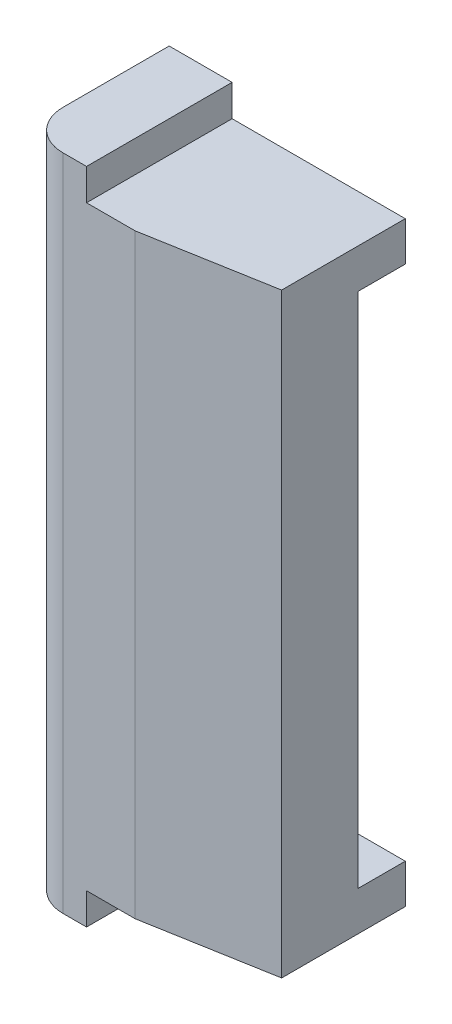
ISO-10303-21;
HEADER;
FILE_DESCRIPTION(('STEP AP214'),'2;1');
FILE_NAME('part.step','',(''),(''),'','','');
FILE_SCHEMA(('AUTOMOTIVE_DESIGN { 1 0 10303 214 1 1 1 1 }'));
ENDSEC;
DATA;
#1=APPLICATION_CONTEXT('core data for automotive mechanical design processes');
#2=APPLICATION_PROTOCOL_DEFINITION('international standard','automotive_design',2000,#1);
#3=PRODUCT_CONTEXT('',#1,'mechanical');
#4=PRODUCT('Part','Part','',(#3));
#5=PRODUCT_RELATED_PRODUCT_CATEGORY('part','',(#4));
#6=PRODUCT_DEFINITION_FORMATION('','',#4);
#7=PRODUCT_DEFINITION_CONTEXT('part definition',#1,'design');
#8=PRODUCT_DEFINITION('design','',#6,#7);
#9=PRODUCT_DEFINITION_SHAPE('','',#8);
#10=(LENGTH_UNIT() NAMED_UNIT(*) SI_UNIT(.MILLI.,.METRE.));
#11=(NAMED_UNIT(*) PLANE_ANGLE_UNIT() SI_UNIT($,.RADIAN.));
#12=(NAMED_UNIT(*) SI_UNIT($,.STERADIAN.) SOLID_ANGLE_UNIT());
#13=UNCERTAINTY_MEASURE_WITH_UNIT(LENGTH_MEASURE(1.E-05),#10,'distance_accuracy_value','');
#14=(GEOMETRIC_REPRESENTATION_CONTEXT(3) GLOBAL_UNCERTAINTY_ASSIGNED_CONTEXT((#13)) GLOBAL_UNIT_ASSIGNED_CONTEXT((#10,
#11,#12)) REPRESENTATION_CONTEXT('',''));
#15=CARTESIAN_POINT('',(0.,0.,0.));
#16=DIRECTION('',(0.,0.,1.));
#17=DIRECTION('',(1.,0.,0.));
#18=AXIS2_PLACEMENT_3D('',#15,#16,#17);
#19=CARTESIAN_POINT('',(-3.,4.185,2.));
#20=DIRECTION('',(0.,-1.,0.));
#21=DIRECTION('',(0.,0.,-1.));
#22=AXIS2_PLACEMENT_3D('',#19,#20,#21);
#23=PLANE('',#22);
#24=DIRECTION('',(1.,0.,0.));
#25=VECTOR('',#24,1.);
#26=CARTESIAN_POINT('',(-3.,4.185,2.));
#27=LINE('',#26,#25);
#28=CARTESIAN_POINT('',(-2.2,4.185,2.));
#29=VERTEX_POINT('',#28);
#30=CARTESIAN_POINT('',(-2.5,4.185,2.));
#31=VERTEX_POINT('',#30);
#32=EDGE_CURVE('E115',#29,#31,#27,.F.);
#33=ORIENTED_EDGE('',*,*,#32,.F.);
#34=DIRECTION('',(0.,0.,-1.));
#35=VECTOR('',#34,1.);
#36=CARTESIAN_POINT('',(-2.2,4.185,2.));
#37=LINE('',#36,#35);
#38=CARTESIAN_POINT('',(-2.2,4.185,0.15));
#39=VERTEX_POINT('',#38);
#40=EDGE_CURVE('E186',#39,#29,#37,.F.);
#41=ORIENTED_EDGE('',*,*,#40,.F.);
#42=DIRECTION('',(1.,0.,0.));
#43=VECTOR('',#42,1.);
#44=CARTESIAN_POINT('',(-3.,4.185,0.15));
#45=LINE('',#44,#43);
#46=CARTESIAN_POINT('',(-3.,4.185,0.15));
#47=VERTEX_POINT('',#46);
#48=EDGE_CURVE('E126',#47,#39,#45,.T.);
#49=ORIENTED_EDGE('',*,*,#48,.F.);
#50=DIRECTION('',(0.,0.,-1.));
#51=VECTOR('',#50,1.);
#52=CARTESIAN_POINT('',(-3.,4.185,2.));
#53=LINE('',#52,#51);
#54=CARTESIAN_POINT('',(-3.,4.185,1.5));
#55=VERTEX_POINT('',#54);
#56=EDGE_CURVE('E140',#55,#47,#53,.T.);
#57=ORIENTED_EDGE('',*,*,#56,.F.);
#58=CARTESIAN_POINT('',(-2.5,4.185,1.5));
#59=DIRECTION('',(0.,1.,0.));
#60=DIRECTION('',(0.,0.,1.));
#61=AXIS2_PLACEMENT_3D('',#58,#59,#60);
#62=CIRCLE('',#61,0.5);
#63=EDGE_CURVE('E20',#31,#55,#62,.F.);
#64=ORIENTED_EDGE('',*,*,#63,.F.);
#65=EDGE_LOOP('',(#33,#41,#49,#57,#64));
#66=FACE_BOUND('',#65,.T.);
#67=ADVANCED_FACE('F17',(#66),#23,.F.);
#68=CARTESIAN_POINT('',(-2.2,-4.185,2.));
#69=DIRECTION('',(0.,1.,0.));
#70=DIRECTION('',(0.,0.,1.));
#71=AXIS2_PLACEMENT_3D('',#68,#69,#70);
#72=PLANE('',#71);
#73=DIRECTION('',(0.,0.,1.));
#74=VECTOR('',#73,1.);
#75=CARTESIAN_POINT('',(-2.2,-4.185,2.));
#76=LINE('',#75,#74);
#77=CARTESIAN_POINT('',(-2.2,-4.185,0.15));
#78=VERTEX_POINT('',#77);
#79=CARTESIAN_POINT('',(-2.2,-4.185,2.));
#80=VERTEX_POINT('',#79);
#81=EDGE_CURVE('E158',#78,#80,#76,.T.);
#82=ORIENTED_EDGE('',*,*,#81,.T.);
#83=DIRECTION('',(1.,0.,0.));
#84=VECTOR('',#83,1.);
#85=CARTESIAN_POINT('',(-2.2,-4.185,2.));
#86=LINE('',#85,#84);
#87=CARTESIAN_POINT('',(-2.5,-4.185,2.));
#88=VERTEX_POINT('',#87);
#89=EDGE_CURVE('E146',#88,#80,#86,.T.);
#90=ORIENTED_EDGE('',*,*,#89,.F.);
#91=CARTESIAN_POINT('',(-2.5,-4.185,1.5));
#92=DIRECTION('',(0.,1.,0.));
#93=DIRECTION('',(0.,0.,1.));
#94=AXIS2_PLACEMENT_3D('',#91,#92,#93);
#95=CIRCLE('',#94,0.5);
#96=CARTESIAN_POINT('',(-3.,-4.185,1.5));
#97=VERTEX_POINT('',#96);
#98=EDGE_CURVE('E134',#97,#88,#95,.T.);
#99=ORIENTED_EDGE('',*,*,#98,.F.);
#100=DIRECTION('',(0.,0.,1.));
#101=VECTOR('',#100,1.);
#102=CARTESIAN_POINT('',(-3.,-4.185,2.));
#103=LINE('',#102,#101);
#104=CARTESIAN_POINT('',(-3.,-4.185,0.15));
#105=VERTEX_POINT('',#104);
#106=EDGE_CURVE('E141',#105,#97,#103,.T.);
#107=ORIENTED_EDGE('',*,*,#106,.F.);
#108=DIRECTION('',(1.,0.,0.));
#109=VECTOR('',#108,1.);
#110=CARTESIAN_POINT('',(-2.2,-4.185,0.15));
#111=LINE('',#110,#109);
#112=EDGE_CURVE('E176',#78,#105,#111,.F.);
#113=ORIENTED_EDGE('',*,*,#112,.F.);
#114=EDGE_LOOP('',(#82,#90,#99,#107,#113));
#115=FACE_BOUND('',#114,.T.);
#116=ADVANCED_FACE('F217',(#115),#72,.F.);
#117=CARTESIAN_POINT('',(-2.2,3.785,2.));
#118=DIRECTION('',(1.,0.,0.));
#119=DIRECTION('',(0.,0.,-1.));
#120=AXIS2_PLACEMENT_3D('',#117,#118,#119);
#121=PLANE('',#120);
#122=ORIENTED_EDGE('',*,*,#40,.T.);
#123=DIRECTION('',(0.,1.,0.));
#124=VECTOR('',#123,1.);
#125=CARTESIAN_POINT('',(-2.2,3.785,2.));
#126=LINE('',#125,#124);
#127=CARTESIAN_POINT('',(-2.2,3.785,2.));
#128=VERTEX_POINT('',#127);
#129=EDGE_CURVE('E121',#29,#128,#126,.F.);
#130=ORIENTED_EDGE('',*,*,#129,.T.);
#131=DIRECTION('',(0.,0.,-1.));
#132=VECTOR('',#131,1.);
#133=CARTESIAN_POINT('',(-2.2,3.785,2.));
#134=LINE('',#133,#132);
#135=CARTESIAN_POINT('',(-2.2,3.785,0.15));
#136=VERTEX_POINT('',#135);
#137=EDGE_CURVE('E161',#128,#136,#134,.T.);
#138=ORIENTED_EDGE('',*,*,#137,.T.);
#139=DIRECTION('',(0.,1.,0.));
#140=VECTOR('',#139,1.);
#141=CARTESIAN_POINT('',(-2.2,3.785,0.15));
#142=LINE('',#141,#140);
#143=EDGE_CURVE('E178',#136,#39,#142,.T.);
#144=ORIENTED_EDGE('',*,*,#143,.T.);
#145=EDGE_LOOP('',(#122,#130,#138,#144));
#146=FACE_BOUND('',#145,.T.);
#147=ADVANCED_FACE('F206',(#146),#121,.T.);
#148=CARTESIAN_POINT('',(-2.2,-3.785,2.));
#149=DIRECTION('',(-1.,0.,0.));
#150=DIRECTION('',(0.,0.,1.));
#151=AXIS2_PLACEMENT_3D('',#148,#149,#150);
#152=PLANE('',#151);
#153=ORIENTED_EDGE('',*,*,#81,.F.);
#154=DIRECTION('',(0.,1.,0.));
#155=VECTOR('',#154,1.);
#156=CARTESIAN_POINT('',(-2.2,-3.785,0.15));
#157=LINE('',#156,#155);
#158=CARTESIAN_POINT('',(-2.2,-3.785,0.15));
#159=VERTEX_POINT('',#158);
#160=EDGE_CURVE('E162',#159,#78,#157,.F.);
#161=ORIENTED_EDGE('',*,*,#160,.F.);
#162=DIRECTION('',(0.,0.,1.));
#163=VECTOR('',#162,1.);
#164=CARTESIAN_POINT('',(-2.2,-3.785,2.));
#165=LINE('',#164,#163);
#166=CARTESIAN_POINT('',(-2.2,-3.785,2.));
#167=VERTEX_POINT('',#166);
#168=EDGE_CURVE('E221',#159,#167,#165,.T.);
#169=ORIENTED_EDGE('',*,*,#168,.T.);
#170=DIRECTION('',(0.,1.,0.));
#171=VECTOR('',#170,1.);
#172=CARTESIAN_POINT('',(-2.2,0.,2.));
#173=LINE('',#172,#171);
#174=EDGE_CURVE('E165',#80,#167,#173,.T.);
#175=ORIENTED_EDGE('',*,*,#174,.F.);
#176=EDGE_LOOP('',(#153,#161,#169,#175));
#177=FACE_BOUND('',#176,.T.);
#178=ADVANCED_FACE('F219',(#177),#152,.F.);
#179=CARTESIAN_POINT('',(-2.2,3.785,2.));
#180=DIRECTION('',(0.,-1.,0.));
#181=DIRECTION('',(0.,0.,-1.));
#182=AXIS2_PLACEMENT_3D('',#179,#180,#181);
#183=PLANE('',#182);
#184=DIRECTION('',(0.,0.,-1.));
#185=VECTOR('',#184,1.);
#186=CARTESIAN_POINT('',(0.,3.785,2.));
#187=LINE('',#186,#185);
#188=CARTESIAN_POINT('',(0.,3.785,0.15));
#189=VERTEX_POINT('',#188);
#190=CARTESIAN_POINT('',(0.,3.785,1.72101905787487));
#191=VERTEX_POINT('',#190);
#192=EDGE_CURVE('E233',#189,#191,#187,.F.);
#193=ORIENTED_EDGE('',*,*,#192,.F.);
#194=DIRECTION('',(1.,0.,0.));
#195=VECTOR('',#194,1.);
#196=CARTESIAN_POINT('',(-1.577396657872,3.785,0.15));
#197=LINE('',#196,#195);
#198=EDGE_CURVE('E135',#189,#136,#197,.F.);
#199=ORIENTED_EDGE('',*,*,#198,.T.);
#200=ORIENTED_EDGE('',*,*,#137,.F.);
#201=DIRECTION('',(1.,0.,0.));
#202=VECTOR('',#201,1.);
#203=CARTESIAN_POINT('',(-1.577396657872,3.785,2.));
#204=LINE('',#203,#202);
#205=CARTESIAN_POINT('',(-1.582179545096,3.785,2.00000000000002));
#206=VERTEX_POINT('',#205);
#207=EDGE_CURVE('E168',#206,#128,#204,.F.);
#208=ORIENTED_EDGE('',*,*,#207,.F.);
#209=DIRECTION('',(-0.984807753012258,0.,0.173648177666646));
#210=VECTOR('',#209,1.);
#211=CARTESIAN_POINT('',(0.,3.785,1.721019057875));
#212=LINE('',#211,#210);
#213=EDGE_CURVE('E169',#191,#206,#212,.T.);
#214=ORIENTED_EDGE('',*,*,#213,.F.);
#215=EDGE_LOOP('',(#193,#199,#200,#208,#214));
#216=FACE_BOUND('',#215,.T.);
#217=ADVANCED_FACE('F253',(#216),#183,.F.);
#218=CARTESIAN_POINT('',(-1.577396657872,0.,2.));
#219=DIRECTION('',(0.,0.,1.));
#220=DIRECTION('',(1.,0.,0.));
#221=AXIS2_PLACEMENT_3D('',#218,#219,#220);
#222=PLANE('',#221);
#223=ORIENTED_EDGE('',*,*,#32,.T.);
#224=DIRECTION('',(0.,1.,0.));
#225=VECTOR('',#224,1.);
#226=CARTESIAN_POINT('',(-2.5,-4.185,2.));
#227=LINE('',#226,#225);
#228=EDGE_CURVE('E118',#88,#31,#227,.T.);
#229=ORIENTED_EDGE('',*,*,#228,.F.);
#230=ORIENTED_EDGE('',*,*,#89,.T.);
#231=ORIENTED_EDGE('',*,*,#174,.T.);
#232=DIRECTION('',(1.,0.,0.));
#233=VECTOR('',#232,1.);
#234=CARTESIAN_POINT('',(0.,-3.785,2.));
#235=LINE('',#234,#233);
#236=CARTESIAN_POINT('',(-1.582179545096,-3.785,2.00000000000002));
#237=VERTEX_POINT('',#236);
#238=EDGE_CURVE('E136',#167,#237,#235,.T.);
#239=ORIENTED_EDGE('',*,*,#238,.T.);
#240=DIRECTION('',(0.,1.,0.));
#241=VECTOR('',#240,1.);
#242=CARTESIAN_POINT('',(-1.58217954509598,-4.185,2.0000000000001));
#243=LINE('',#242,#241);
#244=EDGE_CURVE('E255',#206,#237,#243,.F.);
#245=ORIENTED_EDGE('',*,*,#244,.F.);
#246=ORIENTED_EDGE('',*,*,#207,.T.);
#247=ORIENTED_EDGE('',*,*,#129,.F.);
#248=EDGE_LOOP('',(#223,#229,#230,#231,#239,#245,#246,#247));
#249=FACE_BOUND('',#248,.T.);
#250=ADVANCED_FACE('F117',(#249),#222,.T.);
#251=CARTESIAN_POINT('',(0.,-3.785,2.));
#252=DIRECTION('',(0.,1.,0.));
#253=DIRECTION('',(0.,0.,1.));
#254=AXIS2_PLACEMENT_3D('',#251,#252,#253);
#255=PLANE('',#254);
#256=ORIENTED_EDGE('',*,*,#168,.F.);
#257=DIRECTION('',(1.,0.,0.));
#258=VECTOR('',#257,1.);
#259=CARTESIAN_POINT('',(-1.577396657872,-3.785,0.15));
#260=LINE('',#259,#258);
#261=CARTESIAN_POINT('',(0.,-3.785,0.15));
#262=VERTEX_POINT('',#261);
#263=EDGE_CURVE('E175',#159,#262,#260,.T.);
#264=ORIENTED_EDGE('',*,*,#263,.T.);
#265=DIRECTION('',(0.,0.,1.));
#266=VECTOR('',#265,1.);
#267=CARTESIAN_POINT('',(0.,-3.785,2.));
#268=LINE('',#267,#266);
#269=CARTESIAN_POINT('',(0.,-3.785,1.72101905787487));
#270=VERTEX_POINT('',#269);
#271=EDGE_CURVE('E225',#270,#262,#268,.F.);
#272=ORIENTED_EDGE('',*,*,#271,.F.);
#273=DIRECTION('',(0.98480775301219,0.,-0.173648177667033));
#274=VECTOR('',#273,1.);
#275=CARTESIAN_POINT('',(0.939231012049,-3.785,1.555407289332));
#276=LINE('',#275,#274);
#277=EDGE_CURVE('E249',#237,#270,#276,.T.);
#278=ORIENTED_EDGE('',*,*,#277,.F.);
#279=ORIENTED_EDGE('',*,*,#238,.F.);
#280=EDGE_LOOP('',(#256,#264,#272,#278,#279));
#281=FACE_BOUND('',#280,.T.);
#282=ADVANCED_FACE('F275',(#281),#255,.F.);
#283=CARTESIAN_POINT('',(-2.5,-4.185,1.5));
#284=DIRECTION('',(0.,1.,0.));
#285=DIRECTION('',(0.,0.,1.));
#286=AXIS2_PLACEMENT_3D('',#283,#284,#285);
#287=CYLINDRICAL_SURFACE('',#286,0.5);
#288=DIRECTION('',(0.,1.,0.));
#289=VECTOR('',#288,1.);
#290=CARTESIAN_POINT('',(-3.,-4.185,1.5));
#291=LINE('',#290,#289);
#292=EDGE_CURVE('E172',#55,#97,#291,.F.);
#293=ORIENTED_EDGE('',*,*,#292,.T.);
#294=ORIENTED_EDGE('',*,*,#98,.T.);
#295=ORIENTED_EDGE('',*,*,#228,.T.);
#296=ORIENTED_EDGE('',*,*,#63,.T.);
#297=EDGE_LOOP('',(#293,#294,#295,#296));
#298=FACE_BOUND('',#297,.T.);
#299=ADVANCED_FACE('F131',(#298),#287,.T.);
#300=CARTESIAN_POINT('',(-1.577396657872,0.,0.15));
#301=DIRECTION('',(0.,0.,1.));
#302=DIRECTION('',(1.,0.,0.));
#303=AXIS2_PLACEMENT_3D('',#300,#301,#302);
#304=PLANE('',#303);
#305=DIRECTION('',(1.,0.,0.));
#306=VECTOR('',#305,1.);
#307=CARTESIAN_POINT('',(-3.,3.285,0.15));
#308=LINE('',#307,#306);
#309=CARTESIAN_POINT('',(-3.,3.285,0.15));
#310=VERTEX_POINT('',#309);
#311=CARTESIAN_POINT('',(0.,3.285,0.15));
#312=VERTEX_POINT('',#311);
#313=EDGE_CURVE('E251',#310,#312,#308,.T.);
#314=ORIENTED_EDGE('',*,*,#313,.F.);
#315=DIRECTION('',(0.,1.,0.));
#316=VECTOR('',#315,1.);
#317=CARTESIAN_POINT('',(-3.,-4.185,0.15));
#318=LINE('',#317,#316);
#319=EDGE_CURVE('E182',#310,#47,#318,.T.);
#320=ORIENTED_EDGE('',*,*,#319,.T.);
#321=ORIENTED_EDGE('',*,*,#48,.T.);
#322=ORIENTED_EDGE('',*,*,#143,.F.);
#323=ORIENTED_EDGE('',*,*,#198,.F.);
#324=DIRECTION('',(0.,1.,0.));
#325=VECTOR('',#324,1.);
#326=CARTESIAN_POINT('',(0.,0.,0.15));
#327=LINE('',#326,#325);
#328=EDGE_CURVE('E240',#312,#189,#327,.T.);
#329=ORIENTED_EDGE('',*,*,#328,.F.);
#330=EDGE_LOOP('',(#314,#320,#321,#322,#323,#329));
#331=FACE_BOUND('',#330,.T.);
#332=ADVANCED_FACE('F201',(#331),#304,.F.);
#333=CARTESIAN_POINT('',(0.939231012049,-4.185,1.555407289332));
#334=DIRECTION('',(0.173648177667033,0.,0.98480775301219));
#335=DIRECTION('',(0.98480775301219,0.,-0.173648177667033));
#336=AXIS2_PLACEMENT_3D('',#333,#334,#335);
#337=PLANE('',#336);
#338=ORIENTED_EDGE('',*,*,#244,.T.);
#339=ORIENTED_EDGE('',*,*,#277,.T.);
#340=DIRECTION('',(0.,1.,0.));
#341=VECTOR('',#340,1.);
#342=CARTESIAN_POINT('',(0.,3.785,1.721019057875));
#343=LINE('',#342,#341);
#344=EDGE_CURVE('E238',#270,#191,#343,.T.);
#345=ORIENTED_EDGE('',*,*,#344,.T.);
#346=ORIENTED_EDGE('',*,*,#213,.T.);
#347=EDGE_LOOP('',(#338,#339,#345,#346));
#348=FACE_BOUND('',#347,.T.);
#349=ADVANCED_FACE('F246',(#348),#337,.T.);
#350=CARTESIAN_POINT('',(-1.577396657872,0.,0.15));
#351=DIRECTION('',(0.,0.,1.));
#352=DIRECTION('',(1.,0.,0.));
#353=AXIS2_PLACEMENT_3D('',#350,#351,#352);
#354=PLANE('',#353);
#355=ORIENTED_EDGE('',*,*,#160,.T.);
#356=ORIENTED_EDGE('',*,*,#112,.T.);
#357=DIRECTION('',(0.,1.,0.));
#358=VECTOR('',#357,1.);
#359=CARTESIAN_POINT('',(-3.,-4.185,0.15));
#360=LINE('',#359,#358);
#361=CARTESIAN_POINT('',(-3.,-3.285,0.15));
#362=VERTEX_POINT('',#361);
#363=EDGE_CURVE('E174',#105,#362,#360,.T.);
#364=ORIENTED_EDGE('',*,*,#363,.T.);
#365=DIRECTION('',(1.,0.,0.));
#366=VECTOR('',#365,1.);
#367=CARTESIAN_POINT('',(-3.,-3.285,0.15));
#368=LINE('',#367,#366);
#369=CARTESIAN_POINT('',(0.,-3.285,0.15));
#370=VERTEX_POINT('',#369);
#371=EDGE_CURVE('E280',#370,#362,#368,.F.);
#372=ORIENTED_EDGE('',*,*,#371,.F.);
#373=DIRECTION('',(0.,1.,0.));
#374=VECTOR('',#373,1.);
#375=CARTESIAN_POINT('',(0.,3.785,0.15));
#376=LINE('',#375,#374);
#377=EDGE_CURVE('E268',#370,#262,#376,.F.);
#378=ORIENTED_EDGE('',*,*,#377,.T.);
#379=ORIENTED_EDGE('',*,*,#263,.F.);
#380=EDGE_LOOP('',(#355,#356,#364,#372,#378,#379));
#381=FACE_BOUND('',#380,.T.);
#382=ADVANCED_FACE('F278',(#381),#354,.F.);
#383=CARTESIAN_POINT('',(-3.,-4.185,2.));
#384=DIRECTION('',(1.,0.,0.));
#385=DIRECTION('',(0.,0.,-1.));
#386=AXIS2_PLACEMENT_3D('',#383,#384,#385);
#387=PLANE('',#386);
#388=DIRECTION('',(0.,0.,-1.));
#389=VECTOR('',#388,1.);
#390=CARTESIAN_POINT('',(-3.,3.285,0.));
#391=LINE('',#390,#389);
#392=CARTESIAN_POINT('',(-3.,3.285,0.75));
#393=VERTEX_POINT('',#392);
#394=EDGE_CURVE('E194',#393,#310,#391,.T.);
#395=ORIENTED_EDGE('',*,*,#394,.F.);
#396=DIRECTION('',(0.,1.,0.));
#397=VECTOR('',#396,1.);
#398=CARTESIAN_POINT('',(-3.,3.285,0.75));
#399=LINE('',#398,#397);
#400=CARTESIAN_POINT('',(-3.,-3.285,0.75));
#401=VERTEX_POINT('',#400);
#402=EDGE_CURVE('E284',#401,#393,#399,.T.);
#403=ORIENTED_EDGE('',*,*,#402,.F.);
#404=DIRECTION('',(0.,0.,1.));
#405=VECTOR('',#404,1.);
#406=CARTESIAN_POINT('',(-3.,-3.285,0.75));
#407=LINE('',#406,#405);
#408=EDGE_CURVE('E271',#362,#401,#407,.T.);
#409=ORIENTED_EDGE('',*,*,#408,.F.);
#410=ORIENTED_EDGE('',*,*,#363,.F.);
#411=ORIENTED_EDGE('',*,*,#106,.T.);
#412=ORIENTED_EDGE('',*,*,#292,.F.);
#413=ORIENTED_EDGE('',*,*,#56,.T.);
#414=ORIENTED_EDGE('',*,*,#319,.F.);
#415=EDGE_LOOP('',(#395,#403,#409,#410,#411,#412,#413,#414));
#416=FACE_BOUND('',#415,.T.);
#417=ADVANCED_FACE('F295',(#416),#387,.F.);
#418=CARTESIAN_POINT('',(-3.,3.285,0.));
#419=DIRECTION('',(0.,-1.,0.));
#420=DIRECTION('',(0.,0.,-1.));
#421=AXIS2_PLACEMENT_3D('',#418,#419,#420);
#422=PLANE('',#421);
#423=DIRECTION('',(0.,0.,1.));
#424=VECTOR('',#423,1.);
#425=CARTESIAN_POINT('',(0.,3.285,2.));
#426=LINE('',#425,#424);
#427=CARTESIAN_POINT('',(0.,3.285,0.75));
#428=VERTEX_POINT('',#427);
#429=EDGE_CURVE('E250',#312,#428,#426,.T.);
#430=ORIENTED_EDGE('',*,*,#429,.T.);
#431=DIRECTION('',(-1.,0.,0.));
#432=VECTOR('',#431,1.);
#433=CARTESIAN_POINT('',(-3.,3.285,0.75));
#434=LINE('',#433,#432);
#435=EDGE_CURVE('E291',#393,#428,#434,.F.);
#436=ORIENTED_EDGE('',*,*,#435,.F.);
#437=ORIENTED_EDGE('',*,*,#394,.T.);
#438=ORIENTED_EDGE('',*,*,#313,.T.);
#439=EDGE_LOOP('',(#430,#436,#437,#438));
#440=FACE_BOUND('',#439,.T.);
#441=ADVANCED_FACE('F263',(#440),#422,.T.);
#442=CARTESIAN_POINT('',(0.,3.785,2.));
#443=DIRECTION('',(-1.,0.,0.));
#444=DIRECTION('',(0.,0.,1.));
#445=AXIS2_PLACEMENT_3D('',#442,#443,#444);
#446=PLANE('',#445);
#447=ORIENTED_EDGE('',*,*,#377,.F.);
#448=DIRECTION('',(0.,0.,1.));
#449=VECTOR('',#448,1.);
#450=CARTESIAN_POINT('',(0.,-3.285,0.75));
#451=LINE('',#450,#449);
#452=CARTESIAN_POINT('',(0.,-3.285,0.75));
#453=VERTEX_POINT('',#452);
#454=EDGE_CURVE('E35',#453,#370,#451,.F.);
#455=ORIENTED_EDGE('',*,*,#454,.F.);
#456=DIRECTION('',(0.,1.,0.));
#457=VECTOR('',#456,1.);
#458=CARTESIAN_POINT('',(0.,3.285,0.75));
#459=LINE('',#458,#457);
#460=EDGE_CURVE('E26',#428,#453,#459,.F.);
#461=ORIENTED_EDGE('',*,*,#460,.F.);
#462=ORIENTED_EDGE('',*,*,#429,.F.);
#463=ORIENTED_EDGE('',*,*,#328,.T.);
#464=ORIENTED_EDGE('',*,*,#192,.T.);
#465=ORIENTED_EDGE('',*,*,#344,.F.);
#466=ORIENTED_EDGE('',*,*,#271,.T.);
#467=EDGE_LOOP('',(#447,#455,#461,#462,#463,#464,#465,#466));
#468=FACE_BOUND('',#467,.T.);
#469=ADVANCED_FACE('F237',(#468),#446,.F.);
#470=CARTESIAN_POINT('',(-3.,-3.285,0.75));
#471=DIRECTION('',(0.,1.,0.));
#472=DIRECTION('',(0.,0.,1.));
#473=AXIS2_PLACEMENT_3D('',#470,#471,#472);
#474=PLANE('',#473);
#475=ORIENTED_EDGE('',*,*,#454,.T.);
#476=ORIENTED_EDGE('',*,*,#371,.T.);
#477=ORIENTED_EDGE('',*,*,#408,.T.);
#478=DIRECTION('',(-1.,0.,0.));
#479=VECTOR('',#478,1.);
#480=CARTESIAN_POINT('',(-3.,-3.285,0.75));
#481=LINE('',#480,#479);
#482=EDGE_CURVE('E11',#453,#401,#481,.T.);
#483=ORIENTED_EDGE('',*,*,#482,.F.);
#484=EDGE_LOOP('',(#475,#476,#477,#483));
#485=FACE_BOUND('',#484,.T.);
#486=ADVANCED_FACE('F286',(#485),#474,.T.);
#487=CARTESIAN_POINT('',(-3.,3.285,0.75));
#488=DIRECTION('',(0.,0.,-1.));
#489=DIRECTION('',(-1.,0.,0.));
#490=AXIS2_PLACEMENT_3D('',#487,#488,#489);
#491=PLANE('',#490);
#492=ORIENTED_EDGE('',*,*,#460,.T.);
#493=ORIENTED_EDGE('',*,*,#482,.T.);
#494=ORIENTED_EDGE('',*,*,#402,.T.);
#495=ORIENTED_EDGE('',*,*,#435,.T.);
#496=EDGE_LOOP('',(#492,#493,#494,#495));
#497=FACE_BOUND('',#496,.T.);
#498=ADVANCED_FACE('F294',(#497),#491,.T.);
#499=CLOSED_SHELL('',(#67,#116,#147,#178,#217,#250,#282,#299,#332,#349,#382,#417,#441,#469,#486,#498));
#500=MANIFOLD_SOLID_BREP('B1',#499);
#501=ADVANCED_BREP_SHAPE_REPRESENTATION('',(#18,#500),#14);
#502=SHAPE_DEFINITION_REPRESENTATION(#9,#501);
ENDSEC;
END-ISO-10303-21;
